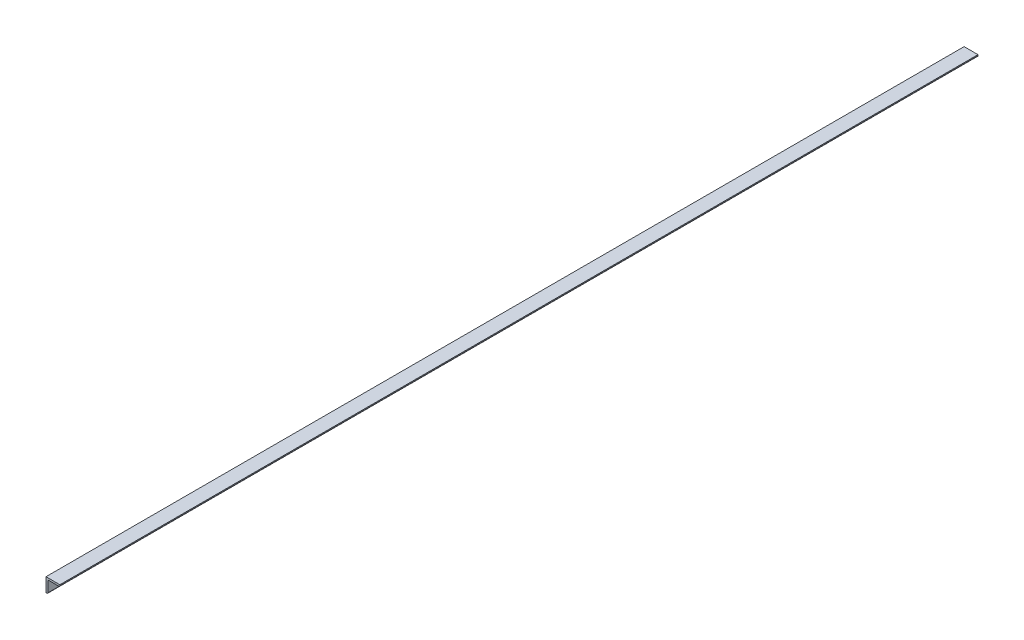
ISO-10303-21;
HEADER;
FILE_DESCRIPTION(('STEP AP214'),'2;1');
FILE_NAME('part.step','',(''),(''),'','','');
FILE_SCHEMA(('AUTOMOTIVE_DESIGN { 1 0 10303 214 1 1 1 1 }'));
ENDSEC;
DATA;
#1=APPLICATION_CONTEXT('core data for automotive mechanical design processes');
#2=APPLICATION_PROTOCOL_DEFINITION('international standard','automotive_design',2000,#1);
#3=PRODUCT_CONTEXT('',#1,'mechanical');
#4=PRODUCT('Part','Part','',(#3));
#5=PRODUCT_RELATED_PRODUCT_CATEGORY('part','',(#4));
#6=PRODUCT_DEFINITION_FORMATION('','',#4);
#7=PRODUCT_DEFINITION_CONTEXT('part definition',#1,'design');
#8=PRODUCT_DEFINITION('design','',#6,#7);
#9=PRODUCT_DEFINITION_SHAPE('','',#8);
#10=(LENGTH_UNIT() NAMED_UNIT(*) SI_UNIT(.MILLI.,.METRE.));
#11=(NAMED_UNIT(*) PLANE_ANGLE_UNIT() SI_UNIT($,.RADIAN.));
#12=(NAMED_UNIT(*) SI_UNIT($,.STERADIAN.) SOLID_ANGLE_UNIT());
#13=UNCERTAINTY_MEASURE_WITH_UNIT(LENGTH_MEASURE(1.E-05),#10,'distance_accuracy_value','');
#14=(GEOMETRIC_REPRESENTATION_CONTEXT(3) GLOBAL_UNCERTAINTY_ASSIGNED_CONTEXT((#13)) GLOBAL_UNIT_ASSIGNED_CONTEXT((#10,
#11,#12)) REPRESENTATION_CONTEXT('',''));
#15=CARTESIAN_POINT('',(0.,0.,0.));
#16=DIRECTION('',(0.,0.,1.));
#17=DIRECTION('',(1.,0.,0.));
#18=AXIS2_PLACEMENT_3D('',#15,#16,#17);
#19=CARTESIAN_POINT('',(-8.62500000000004,36.8125,1985.));
#20=DIRECTION('',(-1.,0.,0.));
#21=DIRECTION('',(0.,0.,1.));
#22=AXIS2_PLACEMENT_3D('',#19,#20,#21);
#23=PLANE('',#22);
#24=DIRECTION('',(0.,1.,0.));
#25=VECTOR('',#24,1.);
#26=CARTESIAN_POINT('',(-8.62500000000004,36.8125,0.));
#27=LINE('',#26,#25);
#28=CARTESIAN_POINT('',(-8.62500000000004,36.8125,0.));
#29=VERTEX_POINT('',#28);
#30=CARTESIAN_POINT('',(-8.62500000000004,38.8125,0.));
#31=VERTEX_POINT('',#30);
#32=EDGE_CURVE('E135',#29,#31,#27,.T.);
#33=ORIENTED_EDGE('',*,*,#32,.T.);
#34=DIRECTION('',(0.,0.,-1.));
#35=VECTOR('',#34,1.);
#36=CARTESIAN_POINT('',(-8.62500000000004,38.8125,1985.));
#37=LINE('',#36,#35);
#38=CARTESIAN_POINT('',(-8.62500000000004,38.8125,1985.));
#39=VERTEX_POINT('',#38);
#40=EDGE_CURVE('E11',#39,#31,#37,.T.);
#41=ORIENTED_EDGE('',*,*,#40,.F.);
#42=DIRECTION('',(0.,1.,0.));
#43=VECTOR('',#42,1.);
#44=CARTESIAN_POINT('',(-8.62500000000004,36.8125,1985.));
#45=LINE('',#44,#43);
#46=CARTESIAN_POINT('',(-8.62500000000004,36.8125,1985.));
#47=VERTEX_POINT('',#46);
#48=EDGE_CURVE('E151',#47,#39,#45,.T.);
#49=ORIENTED_EDGE('',*,*,#48,.F.);
#50=DIRECTION('',(0.,0.,-1.));
#51=VECTOR('',#50,1.);
#52=CARTESIAN_POINT('',(-8.62500000000004,36.8125,1985.));
#53=LINE('',#52,#51);
#54=EDGE_CURVE('E131',#47,#29,#53,.T.);
#55=ORIENTED_EDGE('',*,*,#54,.T.);
#56=EDGE_LOOP('',(#33,#41,#49,#55));
#57=FACE_BOUND('',#56,.T.);
#58=ADVANCED_FACE('F33',(#57),#23,.F.);
#59=CARTESIAN_POINT('',(-8.62500000000004,38.8125,1985.));
#60=DIRECTION('',(0.,-1.,0.));
#61=DIRECTION('',(1.,0.,0.));
#62=AXIS2_PLACEMENT_3D('',#59,#60,#61);
#63=PLANE('',#62);
#64=DIRECTION('',(-1.,0.,0.));
#65=VECTOR('',#64,1.);
#66=CARTESIAN_POINT('',(-8.62500000000004,38.8125,0.));
#67=LINE('',#66,#65);
#68=CARTESIAN_POINT('',(-38.625,38.8125,0.));
#69=VERTEX_POINT('',#68);
#70=EDGE_CURVE('E138',#31,#69,#67,.T.);
#71=ORIENTED_EDGE('',*,*,#70,.T.);
#72=DIRECTION('',(0.,0.,-1.));
#73=VECTOR('',#72,1.);
#74=CARTESIAN_POINT('',(-38.625,38.8125,1985.));
#75=LINE('',#74,#73);
#76=CARTESIAN_POINT('',(-38.625,38.8125,1985.));
#77=VERTEX_POINT('',#76);
#78=EDGE_CURVE('E41',#77,#69,#75,.T.);
#79=ORIENTED_EDGE('',*,*,#78,.F.);
#80=DIRECTION('',(-1.,0.,0.));
#81=VECTOR('',#80,1.);
#82=CARTESIAN_POINT('',(-8.62500000000004,38.8125,1985.));
#83=LINE('',#82,#81);
#84=EDGE_CURVE('E95',#39,#77,#83,.T.);
#85=ORIENTED_EDGE('',*,*,#84,.F.);
#86=ORIENTED_EDGE('',*,*,#40,.T.);
#87=EDGE_LOOP('',(#71,#79,#85,#86));
#88=FACE_BOUND('',#87,.T.);
#89=ADVANCED_FACE('F194',(#88),#63,.F.);
#90=CARTESIAN_POINT('',(-38.625,38.8125,1985.));
#91=DIRECTION('',(1.,0.,0.));
#92=DIRECTION('',(0.,1.,0.));
#93=AXIS2_PLACEMENT_3D('',#90,#91,#92);
#94=PLANE('',#93);
#95=DIRECTION('',(0.,-1.,0.));
#96=VECTOR('',#95,1.);
#97=CARTESIAN_POINT('',(-38.625,38.8125,0.));
#98=LINE('',#97,#96);
#99=CARTESIAN_POINT('',(-38.625,8.81250000000001,0.));
#100=VERTEX_POINT('',#99);
#101=EDGE_CURVE('E140',#69,#100,#98,.T.);
#102=ORIENTED_EDGE('',*,*,#101,.T.);
#103=DIRECTION('',(0.,0.,-1.));
#104=VECTOR('',#103,1.);
#105=CARTESIAN_POINT('',(-38.625,8.81250000000001,1985.));
#106=LINE('',#105,#104);
#107=CARTESIAN_POINT('',(-38.625,8.81250000000001,1985.));
#108=VERTEX_POINT('',#107);
#109=EDGE_CURVE('E161',#108,#100,#106,.T.);
#110=ORIENTED_EDGE('',*,*,#109,.F.);
#111=DIRECTION('',(0.,-1.,0.));
#112=VECTOR('',#111,1.);
#113=CARTESIAN_POINT('',(-38.625,38.8125,1985.));
#114=LINE('',#113,#112);
#115=EDGE_CURVE('E169',#77,#108,#114,.T.);
#116=ORIENTED_EDGE('',*,*,#115,.F.);
#117=ORIENTED_EDGE('',*,*,#78,.T.);
#118=EDGE_LOOP('',(#102,#110,#116,#117));
#119=FACE_BOUND('',#118,.T.);
#120=ADVANCED_FACE('F167',(#119),#94,.F.);
#121=CARTESIAN_POINT('',(-38.625,8.81250000000001,1985.));
#122=DIRECTION('',(0.,1.,0.));
#123=DIRECTION('',(0.,0.,1.));
#124=AXIS2_PLACEMENT_3D('',#121,#122,#123);
#125=PLANE('',#124);
#126=DIRECTION('',(1.,0.,0.));
#127=VECTOR('',#126,1.);
#128=CARTESIAN_POINT('',(-38.625,8.81250000000001,0.));
#129=LINE('',#128,#127);
#130=CARTESIAN_POINT('',(-36.625,8.81250000000001,0.));
#131=VERTEX_POINT('',#130);
#132=EDGE_CURVE('E142',#100,#131,#129,.T.);
#133=ORIENTED_EDGE('',*,*,#132,.T.);
#134=DIRECTION('',(0.,0.,-1.));
#135=VECTOR('',#134,1.);
#136=CARTESIAN_POINT('',(-36.625,8.81250000000001,1985.));
#137=LINE('',#136,#135);
#138=CARTESIAN_POINT('',(-36.625,8.81250000000001,1985.));
#139=VERTEX_POINT('',#138);
#140=EDGE_CURVE('E158',#139,#131,#137,.T.);
#141=ORIENTED_EDGE('',*,*,#140,.F.);
#142=DIRECTION('',(1.,0.,0.));
#143=VECTOR('',#142,1.);
#144=CARTESIAN_POINT('',(-38.625,8.81250000000001,1985.));
#145=LINE('',#144,#143);
#146=EDGE_CURVE('E185',#108,#139,#145,.T.);
#147=ORIENTED_EDGE('',*,*,#146,.F.);
#148=ORIENTED_EDGE('',*,*,#109,.T.);
#149=EDGE_LOOP('',(#133,#141,#147,#148));
#150=FACE_BOUND('',#149,.T.);
#151=ADVANCED_FACE('F178',(#150),#125,.F.);
#152=CARTESIAN_POINT('',(-36.625,10.8125,1985.));
#153=DIRECTION('',(0.,0.,-1.));
#154=DIRECTION('',(-1.,0.,0.));
#155=AXIS2_PLACEMENT_3D('',#152,#153,#154);
#156=CYLINDRICAL_SURFACE('',#155,2.);
#157=CARTESIAN_POINT('',(-36.625,10.8125,0.));
#158=DIRECTION('',(0.,0.,1.));
#159=DIRECTION('',(1.,0.,0.));
#160=AXIS2_PLACEMENT_3D('',#157,#158,#159);
#161=CIRCLE('',#160,2.);
#162=CARTESIAN_POINT('',(-34.625,10.8125,0.));
#163=VERTEX_POINT('',#162);
#164=EDGE_CURVE('E144',#131,#163,#161,.T.);
#165=ORIENTED_EDGE('',*,*,#164,.T.);
#166=DIRECTION('',(0.,0.,-1.));
#167=VECTOR('',#166,1.);
#168=CARTESIAN_POINT('',(-34.625,10.8125,1985.));
#169=LINE('',#168,#167);
#170=CARTESIAN_POINT('',(-34.625,10.8125,1985.));
#171=VERTEX_POINT('',#170);
#172=EDGE_CURVE('E155',#171,#163,#169,.T.);
#173=ORIENTED_EDGE('',*,*,#172,.F.);
#174=CARTESIAN_POINT('',(-36.625,10.8125,1985.));
#175=DIRECTION('',(0.,0.,1.));
#176=DIRECTION('',(1.,0.,0.));
#177=AXIS2_PLACEMENT_3D('',#174,#175,#176);
#178=CIRCLE('',#177,2.);
#179=EDGE_CURVE('E184',#139,#171,#178,.T.);
#180=ORIENTED_EDGE('',*,*,#179,.F.);
#181=ORIENTED_EDGE('',*,*,#140,.T.);
#182=EDGE_LOOP('',(#165,#173,#180,#181));
#183=FACE_BOUND('',#182,.T.);
#184=ADVANCED_FACE('F182',(#183),#156,.T.);
#185=CARTESIAN_POINT('',(-34.625,10.8125,1985.));
#186=DIRECTION('',(-1.,0.,0.));
#187=DIRECTION('',(0.,0.,1.));
#188=AXIS2_PLACEMENT_3D('',#185,#186,#187);
#189=PLANE('',#188);
#190=DIRECTION('',(0.,1.,0.));
#191=VECTOR('',#190,1.);
#192=CARTESIAN_POINT('',(-34.625,10.8125,0.));
#193=LINE('',#192,#191);
#194=CARTESIAN_POINT('',(-34.625,32.8125,0.));
#195=VERTEX_POINT('',#194);
#196=EDGE_CURVE('E146',#163,#195,#193,.T.);
#197=ORIENTED_EDGE('',*,*,#196,.T.);
#198=DIRECTION('',(0.,0.,-1.));
#199=VECTOR('',#198,1.);
#200=CARTESIAN_POINT('',(-34.625,32.8125,1985.));
#201=LINE('',#200,#199);
#202=CARTESIAN_POINT('',(-34.625,32.8125,1985.));
#203=VERTEX_POINT('',#202);
#204=EDGE_CURVE('E126',#203,#195,#201,.T.);
#205=ORIENTED_EDGE('',*,*,#204,.F.);
#206=DIRECTION('',(0.,1.,0.));
#207=VECTOR('',#206,1.);
#208=CARTESIAN_POINT('',(-34.625,10.8125,1985.));
#209=LINE('',#208,#207);
#210=EDGE_CURVE('E117',#171,#203,#209,.T.);
#211=ORIENTED_EDGE('',*,*,#210,.F.);
#212=ORIENTED_EDGE('',*,*,#172,.T.);
#213=EDGE_LOOP('',(#197,#205,#211,#212));
#214=FACE_BOUND('',#213,.T.);
#215=ADVANCED_FACE('F206',(#214),#189,.F.);
#216=CARTESIAN_POINT('',(-32.625,32.8125,1985.));
#217=DIRECTION('',(0.,0.,-1.));
#218=DIRECTION('',(-1.,0.,0.));
#219=AXIS2_PLACEMENT_3D('',#216,#217,#218);
#220=CYLINDRICAL_SURFACE('',#219,2.);
#221=CARTESIAN_POINT('',(-32.625,32.8125,0.));
#222=DIRECTION('',(0.,0.,-1.));
#223=DIRECTION('',(-1.,0.,0.));
#224=AXIS2_PLACEMENT_3D('',#221,#222,#223);
#225=CIRCLE('',#224,2.);
#226=CARTESIAN_POINT('',(-32.625,34.8125,0.));
#227=VERTEX_POINT('',#226);
#228=EDGE_CURVE('E125',#195,#227,#225,.T.);
#229=ORIENTED_EDGE('',*,*,#228,.T.);
#230=DIRECTION('',(0.,0.,-1.));
#231=VECTOR('',#230,1.);
#232=CARTESIAN_POINT('',(-32.625,34.8125,1985.));
#233=LINE('',#232,#231);
#234=CARTESIAN_POINT('',(-32.625,34.8125,1985.));
#235=VERTEX_POINT('',#234);
#236=EDGE_CURVE('E122',#235,#227,#233,.T.);
#237=ORIENTED_EDGE('',*,*,#236,.F.);
#238=CARTESIAN_POINT('',(-32.625,32.8125,1985.));
#239=DIRECTION('',(0.,0.,-1.));
#240=DIRECTION('',(-1.,0.,0.));
#241=AXIS2_PLACEMENT_3D('',#238,#239,#240);
#242=CIRCLE('',#241,2.);
#243=EDGE_CURVE('E111',#203,#235,#242,.T.);
#244=ORIENTED_EDGE('',*,*,#243,.F.);
#245=ORIENTED_EDGE('',*,*,#204,.T.);
#246=EDGE_LOOP('',(#229,#237,#244,#245));
#247=FACE_BOUND('',#246,.T.);
#248=ADVANCED_FACE('F123',(#247),#220,.F.);
#249=CARTESIAN_POINT('',(-32.625,34.8125,1985.));
#250=DIRECTION('',(0.,1.,0.));
#251=DIRECTION('',(0.,0.,1.));
#252=AXIS2_PLACEMENT_3D('',#249,#250,#251);
#253=PLANE('',#252);
#254=DIRECTION('',(1.,0.,0.));
#255=VECTOR('',#254,1.);
#256=CARTESIAN_POINT('',(-32.625,34.8125,0.));
#257=LINE('',#256,#255);
#258=CARTESIAN_POINT('',(-10.625,34.8125,0.));
#259=VERTEX_POINT('',#258);
#260=EDGE_CURVE('E81',#227,#259,#257,.T.);
#261=ORIENTED_EDGE('',*,*,#260,.T.);
#262=DIRECTION('',(0.,0.,-1.));
#263=VECTOR('',#262,1.);
#264=CARTESIAN_POINT('',(-10.625,34.8125,1985.));
#265=LINE('',#264,#263);
#266=CARTESIAN_POINT('',(-10.625,34.8125,1985.));
#267=VERTEX_POINT('',#266);
#268=EDGE_CURVE('E127',#267,#259,#265,.T.);
#269=ORIENTED_EDGE('',*,*,#268,.F.);
#270=DIRECTION('',(1.,0.,0.));
#271=VECTOR('',#270,1.);
#272=CARTESIAN_POINT('',(-32.625,34.8125,1985.));
#273=LINE('',#272,#271);
#274=EDGE_CURVE('E115',#235,#267,#273,.T.);
#275=ORIENTED_EDGE('',*,*,#274,.F.);
#276=ORIENTED_EDGE('',*,*,#236,.T.);
#277=EDGE_LOOP('',(#261,#269,#275,#276));
#278=FACE_BOUND('',#277,.T.);
#279=ADVANCED_FACE('F129',(#278),#253,.F.);
#280=CARTESIAN_POINT('',(-10.625,36.8125,1985.));
#281=DIRECTION('',(0.,0.,-1.));
#282=DIRECTION('',(-1.,0.,0.));
#283=AXIS2_PLACEMENT_3D('',#280,#281,#282);
#284=CYLINDRICAL_SURFACE('',#283,2.);
#285=CARTESIAN_POINT('',(-10.625,36.8125,0.));
#286=DIRECTION('',(0.,0.,1.));
#287=DIRECTION('',(1.,0.,0.));
#288=AXIS2_PLACEMENT_3D('',#285,#286,#287);
#289=CIRCLE('',#288,2.);
#290=EDGE_CURVE('E87',#259,#29,#289,.T.);
#291=ORIENTED_EDGE('',*,*,#290,.T.);
#292=ORIENTED_EDGE('',*,*,#54,.F.);
#293=CARTESIAN_POINT('',(-10.625,36.8125,1985.));
#294=DIRECTION('',(0.,0.,1.));
#295=DIRECTION('',(1.,0.,0.));
#296=AXIS2_PLACEMENT_3D('',#293,#294,#295);
#297=CIRCLE('',#296,2.);
#298=EDGE_CURVE('E49',#267,#47,#297,.T.);
#299=ORIENTED_EDGE('',*,*,#298,.F.);
#300=ORIENTED_EDGE('',*,*,#268,.T.);
#301=EDGE_LOOP('',(#291,#292,#299,#300));
#302=FACE_BOUND('',#301,.T.);
#303=ADVANCED_FACE('F214',(#302),#284,.T.);
#304=CARTESIAN_POINT('',(-36.625,10.8125,1985.));
#305=DIRECTION('',(0.,0.,1.));
#306=DIRECTION('',(1.,0.,0.));
#307=AXIS2_PLACEMENT_3D('',#304,#305,#306);
#308=PLANE('',#307);
#309=ORIENTED_EDGE('',*,*,#48,.T.);
#310=ORIENTED_EDGE('',*,*,#84,.T.);
#311=ORIENTED_EDGE('',*,*,#115,.T.);
#312=ORIENTED_EDGE('',*,*,#146,.T.);
#313=ORIENTED_EDGE('',*,*,#179,.T.);
#314=ORIENTED_EDGE('',*,*,#210,.T.);
#315=ORIENTED_EDGE('',*,*,#243,.T.);
#316=ORIENTED_EDGE('',*,*,#274,.T.);
#317=ORIENTED_EDGE('',*,*,#298,.T.);
#318=EDGE_LOOP('',(#309,#310,#311,#312,#313,#314,#315,#316,#317));
#319=FACE_BOUND('',#318,.T.);
#320=ADVANCED_FACE('F113',(#319),#308,.T.);
#321=CARTESIAN_POINT('',(-36.625,10.8125,0.));
#322=DIRECTION('',(0.,0.,1.));
#323=DIRECTION('',(1.,0.,0.));
#324=AXIS2_PLACEMENT_3D('',#321,#322,#323);
#325=PLANE('',#324);
#326=ORIENTED_EDGE('',*,*,#32,.F.);
#327=ORIENTED_EDGE('',*,*,#290,.F.);
#328=ORIENTED_EDGE('',*,*,#260,.F.);
#329=ORIENTED_EDGE('',*,*,#228,.F.);
#330=ORIENTED_EDGE('',*,*,#196,.F.);
#331=ORIENTED_EDGE('',*,*,#164,.F.);
#332=ORIENTED_EDGE('',*,*,#132,.F.);
#333=ORIENTED_EDGE('',*,*,#101,.F.);
#334=ORIENTED_EDGE('',*,*,#70,.F.);
#335=EDGE_LOOP('',(#326,#327,#328,#329,#330,#331,#332,#333,#334));
#336=FACE_BOUND('',#335,.T.);
#337=ADVANCED_FACE('F173',(#336),#325,.F.);
#338=CLOSED_SHELL('',(#58,#89,#120,#151,#184,#215,#248,#279,#303,#320,#337));
#339=MANIFOLD_SOLID_BREP('B2',#338);
#340=ADVANCED_BREP_SHAPE_REPRESENTATION('',(#18,#339),#14);
#341=SHAPE_DEFINITION_REPRESENTATION(#9,#340);
ENDSEC;
END-ISO-10303-21;
